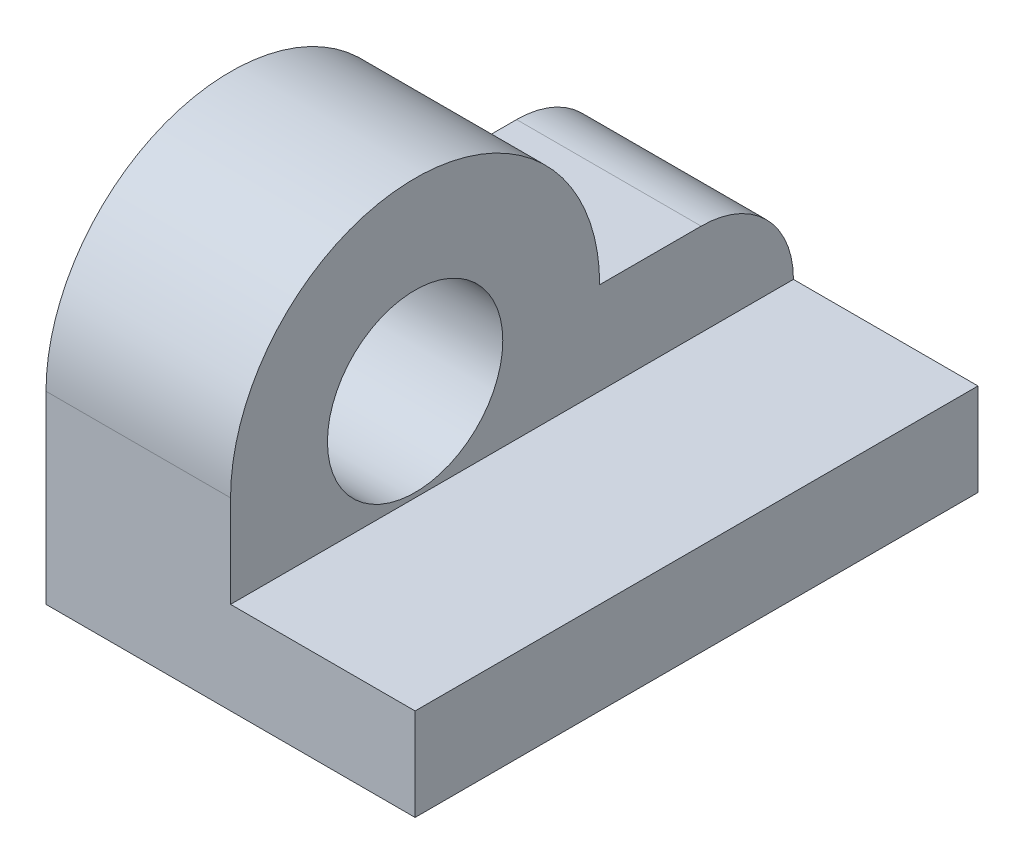
ISO-10303-21;
HEADER;
FILE_DESCRIPTION(('STEP AP214'),'2;1');
FILE_NAME('part.step','',(''),(''),'','','');
FILE_SCHEMA(('AUTOMOTIVE_DESIGN { 1 0 10303 214 1 1 1 1 }'));
ENDSEC;
DATA;
#1=APPLICATION_CONTEXT('core data for automotive mechanical design processes');
#2=APPLICATION_PROTOCOL_DEFINITION('international standard','automotive_design',2000,#1);
#3=PRODUCT_CONTEXT('',#1,'mechanical');
#4=PRODUCT('Part','Part','',(#3));
#5=PRODUCT_RELATED_PRODUCT_CATEGORY('part','',(#4));
#6=PRODUCT_DEFINITION_FORMATION('','',#4);
#7=PRODUCT_DEFINITION_CONTEXT('part definition',#1,'design');
#8=PRODUCT_DEFINITION('design','',#6,#7);
#9=PRODUCT_DEFINITION_SHAPE('','',#8);
#10=(LENGTH_UNIT() NAMED_UNIT(*) SI_UNIT(.MILLI.,.METRE.));
#11=(NAMED_UNIT(*) PLANE_ANGLE_UNIT() SI_UNIT($,.RADIAN.));
#12=(NAMED_UNIT(*) SI_UNIT($,.STERADIAN.) SOLID_ANGLE_UNIT());
#13=UNCERTAINTY_MEASURE_WITH_UNIT(LENGTH_MEASURE(1.E-05),#10,'distance_accuracy_value','');
#14=(GEOMETRIC_REPRESENTATION_CONTEXT(3) GLOBAL_UNCERTAINTY_ASSIGNED_CONTEXT((#13)) GLOBAL_UNIT_ASSIGNED_CONTEXT((#10,
#11,#12)) REPRESENTATION_CONTEXT('',''));
#15=CARTESIAN_POINT('',(0.,0.,0.));
#16=DIRECTION('',(0.,0.,1.));
#17=DIRECTION('',(1.,0.,0.));
#18=AXIS2_PLACEMENT_3D('',#15,#16,#17);
#19=CARTESIAN_POINT('',(-20.,40.,-30.5));
#20=DIRECTION('',(1.,0.,0.));
#21=DIRECTION('',(0.,0.,-1.));
#22=AXIS2_PLACEMENT_3D('',#19,#20,#21);
#23=PLANE('',#22);
#24=CARTESIAN_POINT('',(-20.,20.,10.5));
#25=DIRECTION('',(1.,0.,0.));
#26=DIRECTION('',(0.,0.,-1.));
#27=AXIS2_PLACEMENT_3D('',#24,#25,#26);
#28=CIRCLE('',#27,9.5);
#29=CARTESIAN_POINT('',(-20.,20.,1.));
#30=VERTEX_POINT('',#29);
#31=EDGE_CURVE('E185',#30,#30,#28,.T.);
#32=ORIENTED_EDGE('',*,*,#31,.T.);
#33=EDGE_LOOP('',(#32));
#34=FACE_BOUND('',#33,.T.);
#35=DIRECTION('',(0.,-1.,0.));
#36=VECTOR('',#35,1.);
#37=CARTESIAN_POINT('',(-20.,40.,30.5));
#38=LINE('',#37,#36);
#39=CARTESIAN_POINT('',(-20.,20.,30.5));
#40=VERTEX_POINT('',#39);
#41=CARTESIAN_POINT('',(-20.,0.,30.5));
#42=VERTEX_POINT('',#41);
#43=EDGE_CURVE('E106',#40,#42,#38,.T.);
#44=ORIENTED_EDGE('',*,*,#43,.F.);
#45=CARTESIAN_POINT('',(-20.,20.,10.5));
#46=DIRECTION('',(1.,0.,0.));
#47=DIRECTION('',(0.,0.,-1.));
#48=AXIS2_PLACEMENT_3D('',#45,#46,#47);
#49=CIRCLE('',#48,20.);
#50=CARTESIAN_POINT('',(-20.,20.,-9.5));
#51=VERTEX_POINT('',#50);
#52=EDGE_CURVE('E167',#51,#40,#49,.T.);
#53=ORIENTED_EDGE('',*,*,#52,.F.);
#54=DIRECTION('',(0.,0.,-1.));
#55=VECTOR('',#54,1.);
#56=CARTESIAN_POINT('',(-20.,20.,0.));
#57=LINE('',#56,#55);
#58=CARTESIAN_POINT('',(-20.,20.,-20.4998883392565));
#59=VERTEX_POINT('',#58);
#60=EDGE_CURVE('E221',#51,#59,#57,.T.);
#61=ORIENTED_EDGE('',*,*,#60,.T.);
#62=CARTESIAN_POINT('',(-20.,10.,-20.4998883392566));
#63=DIRECTION('',(1.,0.,0.));
#64=DIRECTION('',(0.,0.,-1.));
#65=AXIS2_PLACEMENT_3D('',#62,#63,#64);
#66=CIRCLE('',#65,9.99999999999996);
#67=CARTESIAN_POINT('',(-20.,10.0472565071322,-30.4997766797598));
#68=VERTEX_POINT('',#67);
#69=EDGE_CURVE('E229',#59,#68,#66,.F.);
#70=ORIENTED_EDGE('',*,*,#69,.T.);
#71=DIRECTION('',(0.,-0.99998883405033,-0.00472565071315904));
#72=VECTOR('',#71,1.);
#73=CARTESIAN_POINT('',(-20.,0.144354055123449,-30.5465748603406));
#74=LINE('',#73,#72);
#75=CARTESIAN_POINT('',(-20.,10.,-30.5));
#76=VERTEX_POINT('',#75);
#77=EDGE_CURVE('E178',#68,#76,#74,.T.);
#78=ORIENTED_EDGE('',*,*,#77,.T.);
#79=DIRECTION('',(0.,-1.,0.));
#80=VECTOR('',#79,1.);
#81=CARTESIAN_POINT('',(-20.,40.,-30.5));
#82=LINE('',#81,#80);
#83=CARTESIAN_POINT('',(-20.,0.,-30.5));
#84=VERTEX_POINT('',#83);
#85=EDGE_CURVE('E12',#76,#84,#82,.T.);
#86=ORIENTED_EDGE('',*,*,#85,.T.);
#87=DIRECTION('',(0.,0.,1.));
#88=VECTOR('',#87,1.);
#89=CARTESIAN_POINT('',(-20.,0.,-30.5));
#90=LINE('',#89,#88);
#91=EDGE_CURVE('E187',#84,#42,#90,.T.);
#92=ORIENTED_EDGE('',*,*,#91,.T.);
#93=EDGE_LOOP('',(#44,#53,#61,#70,#78,#86,#92));
#94=FACE_BOUND('',#93,.T.);
#95=ADVANCED_FACE('F97',(#34,#94),#23,.F.);
#96=CARTESIAN_POINT('',(-20.,40.,30.5));
#97=DIRECTION('',(0.,0.,-1.));
#98=DIRECTION('',(-1.,0.,0.));
#99=AXIS2_PLACEMENT_3D('',#96,#97,#98);
#100=PLANE('',#99);
#101=DIRECTION('',(1.,0.,0.));
#102=VECTOR('',#101,1.);
#103=CARTESIAN_POINT('',(-20.,20.,30.5));
#104=LINE('',#103,#102);
#105=CARTESIAN_POINT('',(0.,20.,30.5));
#106=VERTEX_POINT('',#105);
#107=EDGE_CURVE('E171',#40,#106,#104,.T.);
#108=ORIENTED_EDGE('',*,*,#107,.F.);
#109=ORIENTED_EDGE('',*,*,#43,.T.);
#110=DIRECTION('',(1.,0.,0.));
#111=VECTOR('',#110,1.);
#112=CARTESIAN_POINT('',(-20.,0.,30.5));
#113=LINE('',#112,#111);
#114=CARTESIAN_POINT('',(20.,0.,30.5));
#115=VERTEX_POINT('',#114);
#116=EDGE_CURVE('E193',#42,#115,#113,.T.);
#117=ORIENTED_EDGE('',*,*,#116,.T.);
#118=DIRECTION('',(0.,-1.,0.));
#119=VECTOR('',#118,1.);
#120=CARTESIAN_POINT('',(20.,40.,30.5));
#121=LINE('',#120,#119);
#122=CARTESIAN_POINT('',(20.,10.,30.5));
#123=VERTEX_POINT('',#122);
#124=EDGE_CURVE('E189',#123,#115,#121,.T.);
#125=ORIENTED_EDGE('',*,*,#124,.F.);
#126=DIRECTION('',(1.,0.,0.));
#127=VECTOR('',#126,1.);
#128=CARTESIAN_POINT('',(20.,10.,30.5));
#129=LINE('',#128,#127);
#130=CARTESIAN_POINT('',(0.,10.,30.5));
#131=VERTEX_POINT('',#130);
#132=EDGE_CURVE('E204',#131,#123,#129,.T.);
#133=ORIENTED_EDGE('',*,*,#132,.F.);
#134=DIRECTION('',(0.,1.,0.));
#135=VECTOR('',#134,1.);
#136=CARTESIAN_POINT('',(0.,10.,30.5));
#137=LINE('',#136,#135);
#138=EDGE_CURVE('E184',#131,#106,#137,.T.);
#139=ORIENTED_EDGE('',*,*,#138,.T.);
#140=EDGE_LOOP('',(#108,#109,#117,#125,#133,#139));
#141=FACE_BOUND('',#140,.T.);
#142=ADVANCED_FACE('F181',(#141),#100,.F.);
#143=CARTESIAN_POINT('',(0.,10.,-30.5));
#144=DIRECTION('',(-1.,0.,0.));
#145=DIRECTION('',(0.,0.,1.));
#146=AXIS2_PLACEMENT_3D('',#143,#144,#145);
#147=PLANE('',#146);
#148=CARTESIAN_POINT('',(0.,20.,10.5));
#149=DIRECTION('',(1.,0.,0.));
#150=DIRECTION('',(0.,0.,-1.));
#151=AXIS2_PLACEMENT_3D('',#148,#149,#150);
#152=CIRCLE('',#151,9.5);
#153=CARTESIAN_POINT('',(0.,20.,0.999999999999999));
#154=VERTEX_POINT('',#153);
#155=EDGE_CURVE('E233',#154,#154,#152,.T.);
#156=ORIENTED_EDGE('',*,*,#155,.F.);
#157=EDGE_LOOP('',(#156));
#158=FACE_BOUND('',#157,.T.);
#159=CARTESIAN_POINT('',(0.,20.,10.5));
#160=DIRECTION('',(1.,0.,0.));
#161=DIRECTION('',(0.,0.,-1.));
#162=AXIS2_PLACEMENT_3D('',#159,#160,#161);
#163=CIRCLE('',#162,20.);
#164=CARTESIAN_POINT('',(0.,20.,-9.5));
#165=VERTEX_POINT('',#164);
#166=EDGE_CURVE('E219',#165,#106,#163,.T.);
#167=ORIENTED_EDGE('',*,*,#166,.T.);
#168=ORIENTED_EDGE('',*,*,#138,.F.);
#169=DIRECTION('',(0.,0.,1.));
#170=VECTOR('',#169,1.);
#171=CARTESIAN_POINT('',(0.,10.,-30.5));
#172=LINE('',#171,#170);
#173=CARTESIAN_POINT('',(0.,10.,-30.5));
#174=VERTEX_POINT('',#173);
#175=EDGE_CURVE('E206',#174,#131,#172,.T.);
#176=ORIENTED_EDGE('',*,*,#175,.F.);
#177=DIRECTION('',(0.,-0.99998883405033,-0.00472565071315904));
#178=VECTOR('',#177,1.);
#179=CARTESIAN_POINT('',(0.,0.144354055123449,-30.5465748603406));
#180=LINE('',#179,#178);
#181=CARTESIAN_POINT('',(0.,10.0472565071322,-30.4997766797598));
#182=VERTEX_POINT('',#181);
#183=EDGE_CURVE('E222',#182,#174,#180,.T.);
#184=ORIENTED_EDGE('',*,*,#183,.F.);
#185=CARTESIAN_POINT('',(0.,10.,-20.4998883392566));
#186=DIRECTION('',(1.,0.,0.));
#187=DIRECTION('',(0.,0.,-1.));
#188=AXIS2_PLACEMENT_3D('',#185,#186,#187);
#189=CIRCLE('',#188,9.99999999999996);
#190=CARTESIAN_POINT('',(0.,20.,-20.4998883392565));
#191=VERTEX_POINT('',#190);
#192=EDGE_CURVE('E224',#191,#182,#189,.F.);
#193=ORIENTED_EDGE('',*,*,#192,.F.);
#194=DIRECTION('',(0.,0.,-1.));
#195=VECTOR('',#194,1.);
#196=CARTESIAN_POINT('',(0.,20.,0.));
#197=LINE('',#196,#195);
#198=EDGE_CURVE('E114',#165,#191,#197,.T.);
#199=ORIENTED_EDGE('',*,*,#198,.F.);
#200=EDGE_LOOP('',(#167,#168,#176,#184,#193,#199));
#201=FACE_BOUND('',#200,.T.);
#202=ADVANCED_FACE('F247',(#158,#201),#147,.F.);
#203=CARTESIAN_POINT('',(-20.,40.,-30.5));
#204=DIRECTION('',(0.,0.,-1.));
#205=DIRECTION('',(-1.,0.,0.));
#206=AXIS2_PLACEMENT_3D('',#203,#204,#205);
#207=PLANE('',#206);
#208=DIRECTION('',(1.,0.,0.));
#209=VECTOR('',#208,1.);
#210=CARTESIAN_POINT('',(-20.,10.,-30.5));
#211=LINE('',#210,#209);
#212=EDGE_CURVE('E215',#76,#174,#211,.T.);
#213=ORIENTED_EDGE('',*,*,#212,.T.);
#214=DIRECTION('',(-1.,0.,0.));
#215=VECTOR('',#214,1.);
#216=CARTESIAN_POINT('',(0.,10.,-30.5));
#217=LINE('',#216,#215);
#218=CARTESIAN_POINT('',(20.,10.,-30.5));
#219=VERTEX_POINT('',#218);
#220=EDGE_CURVE('E209',#219,#174,#217,.T.);
#221=ORIENTED_EDGE('',*,*,#220,.F.);
#222=DIRECTION('',(0.,-1.,0.));
#223=VECTOR('',#222,1.);
#224=CARTESIAN_POINT('',(20.,40.,-30.5));
#225=LINE('',#224,#223);
#226=CARTESIAN_POINT('',(20.,0.,-30.5));
#227=VERTEX_POINT('',#226);
#228=EDGE_CURVE('E101',#219,#227,#225,.T.);
#229=ORIENTED_EDGE('',*,*,#228,.T.);
#230=DIRECTION('',(1.,0.,0.));
#231=VECTOR('',#230,1.);
#232=CARTESIAN_POINT('',(-20.,0.,-30.5));
#233=LINE('',#232,#231);
#234=EDGE_CURVE('E198',#84,#227,#233,.T.);
#235=ORIENTED_EDGE('',*,*,#234,.F.);
#236=ORIENTED_EDGE('',*,*,#85,.F.);
#237=EDGE_LOOP('',(#213,#221,#229,#235,#236));
#238=FACE_BOUND('',#237,.T.);
#239=ADVANCED_FACE('F99',(#238),#207,.T.);
#240=CARTESIAN_POINT('',(20.,40.,-30.5));
#241=DIRECTION('',(1.,0.,0.));
#242=DIRECTION('',(0.,0.,-1.));
#243=AXIS2_PLACEMENT_3D('',#240,#241,#242);
#244=PLANE('',#243);
#245=DIRECTION('',(0.,0.,-1.));
#246=VECTOR('',#245,1.);
#247=CARTESIAN_POINT('',(20.,10.,-30.5));
#248=LINE('',#247,#246);
#249=EDGE_CURVE('E202',#123,#219,#248,.T.);
#250=ORIENTED_EDGE('',*,*,#249,.F.);
#251=ORIENTED_EDGE('',*,*,#124,.T.);
#252=DIRECTION('',(0.,0.,1.));
#253=VECTOR('',#252,1.);
#254=CARTESIAN_POINT('',(20.,0.,-30.5));
#255=LINE('',#254,#253);
#256=EDGE_CURVE('E195',#227,#115,#255,.T.);
#257=ORIENTED_EDGE('',*,*,#256,.F.);
#258=ORIENTED_EDGE('',*,*,#228,.F.);
#259=EDGE_LOOP('',(#250,#251,#257,#258));
#260=FACE_BOUND('',#259,.T.);
#261=ADVANCED_FACE('F269',(#260),#244,.T.);
#262=CARTESIAN_POINT('',(0.,0.,0.));
#263=DIRECTION('',(0.,-1.,0.));
#264=DIRECTION('',(0.,0.,-1.));
#265=AXIS2_PLACEMENT_3D('',#262,#263,#264);
#266=PLANE('',#265);
#267=ORIENTED_EDGE('',*,*,#234,.T.);
#268=ORIENTED_EDGE('',*,*,#256,.T.);
#269=ORIENTED_EDGE('',*,*,#116,.F.);
#270=ORIENTED_EDGE('',*,*,#91,.F.);
#271=EDGE_LOOP('',(#267,#268,#269,#270));
#272=FACE_BOUND('',#271,.T.);
#273=ADVANCED_FACE('F265',(#272),#266,.T.);
#274=CARTESIAN_POINT('',(0.,10.,0.));
#275=DIRECTION('',(0.,-1.,0.));
#276=DIRECTION('',(0.,0.,-1.));
#277=AXIS2_PLACEMENT_3D('',#274,#275,#276);
#278=PLANE('',#277);
#279=ORIENTED_EDGE('',*,*,#220,.T.);
#280=ORIENTED_EDGE('',*,*,#175,.T.);
#281=ORIENTED_EDGE('',*,*,#132,.T.);
#282=ORIENTED_EDGE('',*,*,#249,.T.);
#283=EDGE_LOOP('',(#279,#280,#281,#282));
#284=FACE_BOUND('',#283,.T.);
#285=ADVANCED_FACE('F271',(#284),#278,.F.);
#286=CARTESIAN_POINT('',(-20.,20.,0.));
#287=DIRECTION('',(0.,-1.,0.));
#288=DIRECTION('',(0.,0.,-1.));
#289=AXIS2_PLACEMENT_3D('',#286,#287,#288);
#290=PLANE('',#289);
#291=ORIENTED_EDGE('',*,*,#198,.T.);
#292=DIRECTION('',(1.,0.,0.));
#293=VECTOR('',#292,1.);
#294=CARTESIAN_POINT('',(-20.,20.,-20.4998883392565));
#295=LINE('',#294,#293);
#296=EDGE_CURVE('E177',#59,#191,#295,.T.);
#297=ORIENTED_EDGE('',*,*,#296,.F.);
#298=ORIENTED_EDGE('',*,*,#60,.F.);
#299=DIRECTION('',(1.,0.,0.));
#300=VECTOR('',#299,1.);
#301=CARTESIAN_POINT('',(-20.,20.,-9.5));
#302=LINE('',#301,#300);
#303=EDGE_CURVE('E173',#51,#165,#302,.T.);
#304=ORIENTED_EDGE('',*,*,#303,.T.);
#305=EDGE_LOOP('',(#291,#297,#298,#304));
#306=FACE_BOUND('',#305,.T.);
#307=ADVANCED_FACE('F257',(#306),#290,.F.);
#308=CARTESIAN_POINT('',(-20.,20.,10.5));
#309=DIRECTION('',(1.,0.,0.));
#310=DIRECTION('',(0.,0.,-1.));
#311=AXIS2_PLACEMENT_3D('',#308,#309,#310);
#312=CYLINDRICAL_SURFACE('',#311,20.);
#313=ORIENTED_EDGE('',*,*,#166,.F.);
#314=ORIENTED_EDGE('',*,*,#303,.F.);
#315=ORIENTED_EDGE('',*,*,#52,.T.);
#316=ORIENTED_EDGE('',*,*,#107,.T.);
#317=EDGE_LOOP('',(#313,#314,#315,#316));
#318=FACE_BOUND('',#317,.T.);
#319=ADVANCED_FACE('F170',(#318),#312,.T.);
#320=CARTESIAN_POINT('',(-20.,0.144354055123449,-30.5465748603406));
#321=DIRECTION('',(0.,-0.00472565071315904,0.999988834050329));
#322=DIRECTION('',(0.,-0.99998883405033,-0.00472565071315904));
#323=AXIS2_PLACEMENT_3D('',#320,#321,#322);
#324=PLANE('',#323);
#325=ORIENTED_EDGE('',*,*,#183,.T.);
#326=ORIENTED_EDGE('',*,*,#212,.F.);
#327=ORIENTED_EDGE('',*,*,#77,.F.);
#328=DIRECTION('',(1.,0.,0.));
#329=VECTOR('',#328,1.);
#330=CARTESIAN_POINT('',(-20.,10.0472565071322,-30.4997766797598));
#331=LINE('',#330,#329);
#332=EDGE_CURVE('E213',#68,#182,#331,.T.);
#333=ORIENTED_EDGE('',*,*,#332,.T.);
#334=EDGE_LOOP('',(#325,#326,#327,#333));
#335=FACE_BOUND('',#334,.T.);
#336=ADVANCED_FACE('F349',(#335),#324,.F.);
#337=CARTESIAN_POINT('',(-20.,10.,-20.4998883392566));
#338=DIRECTION('',(1.,0.,0.));
#339=DIRECTION('',(0.,0.,-1.));
#340=AXIS2_PLACEMENT_3D('',#337,#338,#339);
#341=CYLINDRICAL_SURFACE('',#340,9.99999999999996);
#342=ORIENTED_EDGE('',*,*,#192,.T.);
#343=ORIENTED_EDGE('',*,*,#332,.F.);
#344=ORIENTED_EDGE('',*,*,#69,.F.);
#345=ORIENTED_EDGE('',*,*,#296,.T.);
#346=EDGE_LOOP('',(#342,#343,#344,#345));
#347=FACE_BOUND('',#346,.T.);
#348=ADVANCED_FACE('F243',(#347),#341,.T.);
#349=CARTESIAN_POINT('',(-20.,20.,10.5));
#350=DIRECTION('',(1.,0.,0.));
#351=DIRECTION('',(0.,0.,-1.));
#352=AXIS2_PLACEMENT_3D('',#349,#350,#351);
#353=CYLINDRICAL_SURFACE('',#352,9.5);
#354=ORIENTED_EDGE('',*,*,#31,.F.);
#355=EDGE_LOOP('',(#354));
#356=FACE_BOUND('',#355,.T.);
#357=ORIENTED_EDGE('',*,*,#155,.T.);
#358=EDGE_LOOP('',(#357));
#359=FACE_BOUND('',#358,.T.);
#360=ADVANCED_FACE('F240',(#356,#359),#353,.F.);
#361=CLOSED_SHELL('',(#95,#142,#202,#239,#261,#273,#285,#307,#319,#336,#348,#360));
#362=MANIFOLD_SOLID_BREP('B2',#361);
#363=ADVANCED_BREP_SHAPE_REPRESENTATION('',(#18,#362),#14);
#364=SHAPE_DEFINITION_REPRESENTATION(#9,#363);
ENDSEC;
END-ISO-10303-21;
